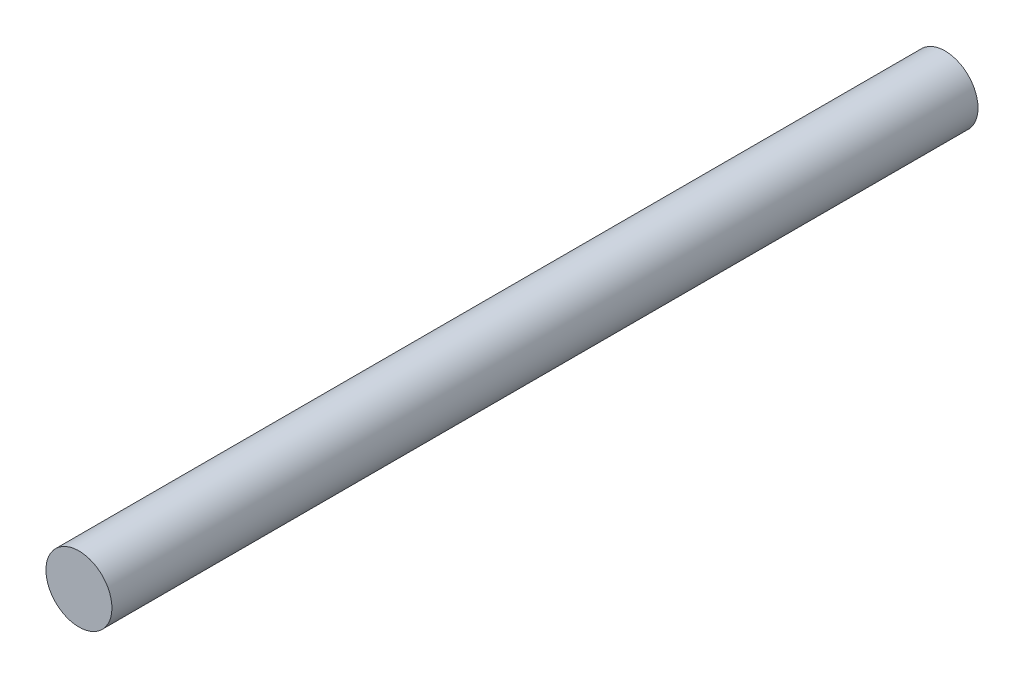
ISO-10303-21;
HEADER;
FILE_DESCRIPTION(('STEP AP214'),'2;1');
FILE_NAME('part.step','',(''),(''),'','','');
FILE_SCHEMA(('AUTOMOTIVE_DESIGN { 1 0 10303 214 1 1 1 1 }'));
ENDSEC;
DATA;
#1=APPLICATION_CONTEXT('core data for automotive mechanical design processes');
#2=APPLICATION_PROTOCOL_DEFINITION('international standard','automotive_design',2000,#1);
#3=PRODUCT_CONTEXT('',#1,'mechanical');
#4=PRODUCT('Part','Part','',(#3));
#5=PRODUCT_RELATED_PRODUCT_CATEGORY('part','',(#4));
#6=PRODUCT_DEFINITION_FORMATION('','',#4);
#7=PRODUCT_DEFINITION_CONTEXT('part definition',#1,'design');
#8=PRODUCT_DEFINITION('design','',#6,#7);
#9=PRODUCT_DEFINITION_SHAPE('','',#8);
#10=(LENGTH_UNIT() NAMED_UNIT(*) SI_UNIT(.MILLI.,.METRE.));
#11=(NAMED_UNIT(*) PLANE_ANGLE_UNIT() SI_UNIT($,.RADIAN.));
#12=(NAMED_UNIT(*) SI_UNIT($,.STERADIAN.) SOLID_ANGLE_UNIT());
#13=UNCERTAINTY_MEASURE_WITH_UNIT(LENGTH_MEASURE(1.E-05),#10,'distance_accuracy_value','');
#14=(GEOMETRIC_REPRESENTATION_CONTEXT(3) GLOBAL_UNCERTAINTY_ASSIGNED_CONTEXT((#13)) GLOBAL_UNIT_ASSIGNED_CONTEXT((#10,
#11,#12)) REPRESENTATION_CONTEXT('',''));
#15=CARTESIAN_POINT('',(0.,0.,0.));
#16=DIRECTION('',(0.,0.,1.));
#17=DIRECTION('',(1.,0.,0.));
#18=AXIS2_PLACEMENT_3D('',#15,#16,#17);
#19=CARTESIAN_POINT('',(0.,0.,105.));
#20=DIRECTION('',(0.,0.,-1.));
#21=DIRECTION('',(-1.,0.,0.));
#22=AXIS2_PLACEMENT_3D('',#19,#20,#21);
#23=CYLINDRICAL_SURFACE('',#22,4.);
#24=CARTESIAN_POINT('',(0.,0.,105.));
#25=DIRECTION('',(0.,0.,1.));
#26=DIRECTION('',(1.,0.,0.));
#27=AXIS2_PLACEMENT_3D('',#24,#25,#26);
#28=CIRCLE('',#27,4.);
#29=CARTESIAN_POINT('',(4.,0.,105.));
#30=VERTEX_POINT('',#29);
#31=EDGE_CURVE('E10',#30,#30,#28,.T.);
#32=ORIENTED_EDGE('',*,*,#31,.F.);
#33=EDGE_LOOP('',(#32));
#34=FACE_BOUND('',#33,.T.);
#35=CARTESIAN_POINT('',(0.,0.,0.));
#36=DIRECTION('',(0.,0.,1.));
#37=DIRECTION('',(1.,0.,0.));
#38=AXIS2_PLACEMENT_3D('',#35,#36,#37);
#39=CIRCLE('',#38,4.);
#40=CARTESIAN_POINT('',(4.,0.,0.));
#41=VERTEX_POINT('',#40);
#42=EDGE_CURVE('E38',#41,#41,#39,.T.);
#43=ORIENTED_EDGE('',*,*,#42,.T.);
#44=EDGE_LOOP('',(#43));
#45=FACE_BOUND('',#44,.T.);
#46=ADVANCED_FACE('F35',(#34,#45),#23,.T.);
#47=CARTESIAN_POINT('',(0.,0.,105.));
#48=DIRECTION('',(0.,0.,1.));
#49=DIRECTION('',(1.,0.,0.));
#50=AXIS2_PLACEMENT_3D('',#47,#48,#49);
#51=PLANE('',#50);
#52=ORIENTED_EDGE('',*,*,#31,.T.);
#53=EDGE_LOOP('',(#52));
#54=FACE_BOUND('',#53,.T.);
#55=ADVANCED_FACE('F50',(#54),#51,.T.);
#56=CARTESIAN_POINT('',(0.,0.,0.));
#57=DIRECTION('',(0.,0.,1.));
#58=DIRECTION('',(1.,0.,0.));
#59=AXIS2_PLACEMENT_3D('',#56,#57,#58);
#60=PLANE('',#59);
#61=ORIENTED_EDGE('',*,*,#42,.F.);
#62=EDGE_LOOP('',(#61));
#63=FACE_BOUND('',#62,.T.);
#64=ADVANCED_FACE('F48',(#63),#60,.F.);
#65=CLOSED_SHELL('',(#46,#55,#64));
#66=MANIFOLD_SOLID_BREP('B2',#65);
#67=ADVANCED_BREP_SHAPE_REPRESENTATION('',(#18,#66),#14);
#68=SHAPE_DEFINITION_REPRESENTATION(#9,#67);
ENDSEC;
END-ISO-10303-21;
